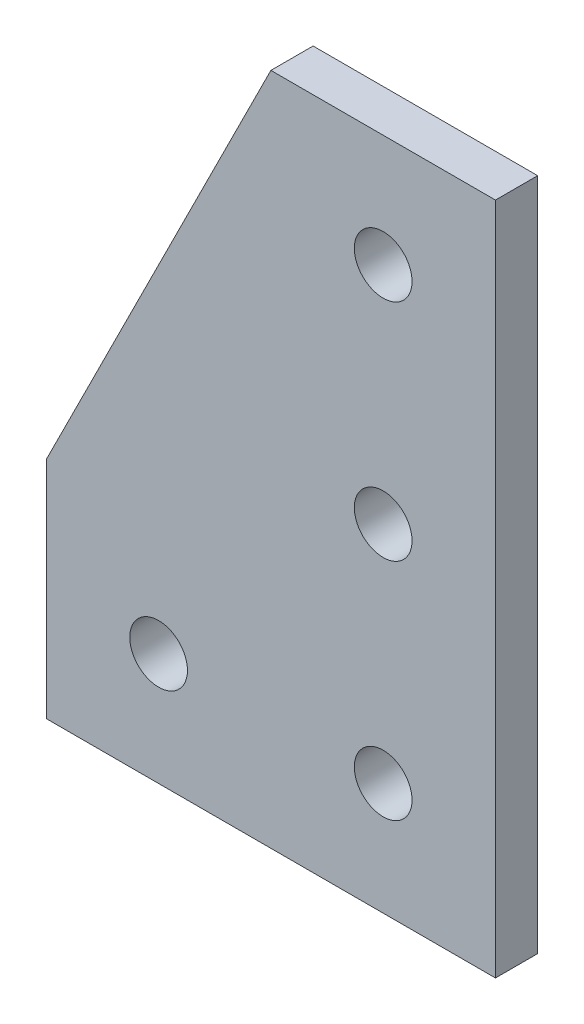
ISO-10303-21;
HEADER;
FILE_DESCRIPTION(('STEP AP214'),'2;1');
FILE_NAME('part.step','',(''),(''),'','','');
FILE_SCHEMA(('AUTOMOTIVE_DESIGN { 1 0 10303 214 1 1 1 1 }'));
ENDSEC;
DATA;
#1=APPLICATION_CONTEXT('core data for automotive mechanical design processes');
#2=APPLICATION_PROTOCOL_DEFINITION('international standard','automotive_design',2000,#1);
#3=PRODUCT_CONTEXT('',#1,'mechanical');
#4=PRODUCT('Part','Part','',(#3));
#5=PRODUCT_RELATED_PRODUCT_CATEGORY('part','',(#4));
#6=PRODUCT_DEFINITION_FORMATION('','',#4);
#7=PRODUCT_DEFINITION_CONTEXT('part definition',#1,'design');
#8=PRODUCT_DEFINITION('design','',#6,#7);
#9=PRODUCT_DEFINITION_SHAPE('','',#8);
#10=(LENGTH_UNIT() NAMED_UNIT(*) SI_UNIT(.MILLI.,.METRE.));
#11=(NAMED_UNIT(*) PLANE_ANGLE_UNIT() SI_UNIT($,.RADIAN.));
#12=(NAMED_UNIT(*) SI_UNIT($,.STERADIAN.) SOLID_ANGLE_UNIT());
#13=UNCERTAINTY_MEASURE_WITH_UNIT(LENGTH_MEASURE(1.E-05),#10,'distance_accuracy_value','');
#14=(GEOMETRIC_REPRESENTATION_CONTEXT(3) GLOBAL_UNCERTAINTY_ASSIGNED_CONTEXT((#13)) GLOBAL_UNIT_ASSIGNED_CONTEXT((#10,
#11,#12)) REPRESENTATION_CONTEXT('',''));
#15=CARTESIAN_POINT('',(0.,0.,0.));
#16=DIRECTION('',(0.,0.,1.));
#17=DIRECTION('',(1.,0.,0.));
#18=AXIS2_PLACEMENT_3D('',#15,#16,#17);
#19=CARTESIAN_POINT('',(0.,0.,0.));
#20=DIRECTION('',(0.,0.,1.));
#21=DIRECTION('',(1.,0.,0.));
#22=AXIS2_PLACEMENT_3D('',#19,#20,#21);
#23=PLANE('',#22);
#24=DIRECTION('',(-0.447213595499958,-0.894427190999916,0.));
#25=VECTOR('',#24,1.);
#26=CARTESIAN_POINT('',(0.,76.2,0.));
#27=LINE('',#26,#25);
#28=CARTESIAN_POINT('',(0.,76.2,0.));
#29=VERTEX_POINT('',#28);
#30=CARTESIAN_POINT('',(-25.4,25.4,0.));
#31=VERTEX_POINT('',#30);
#32=EDGE_CURVE('E187',#29,#31,#27,.T.);
#33=ORIENTED_EDGE('',*,*,#32,.F.);
#34=DIRECTION('',(-1.,0.,0.));
#35=VECTOR('',#34,1.);
#36=CARTESIAN_POINT('',(25.4,76.2,0.));
#37=LINE('',#36,#35);
#38=CARTESIAN_POINT('',(25.4,76.2,0.));
#39=VERTEX_POINT('',#38);
#40=EDGE_CURVE('E26',#39,#29,#37,.T.);
#41=ORIENTED_EDGE('',*,*,#40,.F.);
#42=DIRECTION('',(0.,1.,0.));
#43=VECTOR('',#42,1.);
#44=CARTESIAN_POINT('',(25.4,0.,0.));
#45=LINE('',#44,#43);
#46=CARTESIAN_POINT('',(25.4,0.,0.));
#47=VERTEX_POINT('',#46);
#48=EDGE_CURVE('E121',#47,#39,#45,.T.);
#49=ORIENTED_EDGE('',*,*,#48,.F.);
#50=DIRECTION('',(1.,0.,0.));
#51=VECTOR('',#50,1.);
#52=CARTESIAN_POINT('',(-25.4,0.,0.));
#53=LINE('',#52,#51);
#54=CARTESIAN_POINT('',(-25.4,0.,0.));
#55=VERTEX_POINT('',#54);
#56=EDGE_CURVE('E134',#55,#47,#53,.T.);
#57=ORIENTED_EDGE('',*,*,#56,.F.);
#58=DIRECTION('',(0.,-1.,0.));
#59=VECTOR('',#58,1.);
#60=CARTESIAN_POINT('',(-25.4,25.4,0.));
#61=LINE('',#60,#59);
#62=EDGE_CURVE('E137',#31,#55,#61,.T.);
#63=ORIENTED_EDGE('',*,*,#62,.F.);
#64=EDGE_LOOP('',(#33,#41,#49,#57,#63));
#65=FACE_BOUND('',#64,.T.);
#66=CARTESIAN_POINT('',(12.7,12.7,0.));
#67=DIRECTION('',(0.,0.,1.));
#68=DIRECTION('',(1.,0.,0.));
#69=AXIS2_PLACEMENT_3D('',#66,#67,#68);
#70=CIRCLE('',#69,3.2639);
#71=CARTESIAN_POINT('',(15.9639,12.7,0.));
#72=VERTEX_POINT('',#71);
#73=EDGE_CURVE('E159',#72,#72,#70,.T.);
#74=ORIENTED_EDGE('',*,*,#73,.T.);
#75=EDGE_LOOP('',(#74));
#76=FACE_BOUND('',#75,.T.);
#77=CARTESIAN_POINT('',(12.7,38.1,0.));
#78=DIRECTION('',(0.,0.,1.));
#79=DIRECTION('',(1.,0.,0.));
#80=AXIS2_PLACEMENT_3D('',#77,#78,#79);
#81=CIRCLE('',#80,3.2639);
#82=CARTESIAN_POINT('',(15.9639,38.1,0.));
#83=VERTEX_POINT('',#82);
#84=EDGE_CURVE('E158',#83,#83,#81,.T.);
#85=ORIENTED_EDGE('',*,*,#84,.T.);
#86=EDGE_LOOP('',(#85));
#87=FACE_BOUND('',#86,.T.);
#88=CARTESIAN_POINT('',(12.7,63.5,0.));
#89=DIRECTION('',(0.,0.,1.));
#90=DIRECTION('',(1.,0.,0.));
#91=AXIS2_PLACEMENT_3D('',#88,#89,#90);
#92=CIRCLE('',#91,3.2639);
#93=CARTESIAN_POINT('',(15.9639,63.5,0.));
#94=VERTEX_POINT('',#93);
#95=EDGE_CURVE('E172',#94,#94,#92,.T.);
#96=ORIENTED_EDGE('',*,*,#95,.T.);
#97=EDGE_LOOP('',(#96));
#98=FACE_BOUND('',#97,.T.);
#99=CARTESIAN_POINT('',(-12.7,12.7,0.));
#100=DIRECTION('',(0.,0.,1.));
#101=DIRECTION('',(1.,0.,0.));
#102=AXIS2_PLACEMENT_3D('',#99,#100,#101);
#103=CIRCLE('',#102,3.2639);
#104=CARTESIAN_POINT('',(-9.4361,12.7,0.));
#105=VERTEX_POINT('',#104);
#106=EDGE_CURVE('E38',#105,#105,#103,.T.);
#107=ORIENTED_EDGE('',*,*,#106,.T.);
#108=EDGE_LOOP('',(#107));
#109=FACE_BOUND('',#108,.T.);
#110=ADVANCED_FACE('F16',(#65,#76,#87,#98,#109),#23,.F.);
#111=CARTESIAN_POINT('',(0.,0.,4.7752));
#112=DIRECTION('',(0.,0.,1.));
#113=DIRECTION('',(1.,0.,0.));
#114=AXIS2_PLACEMENT_3D('',#111,#112,#113);
#115=PLANE('',#114);
#116=DIRECTION('',(-0.447213595499958,-0.894427190999916,0.));
#117=VECTOR('',#116,1.);
#118=CARTESIAN_POINT('',(0.,76.2,4.7752));
#119=LINE('',#118,#117);
#120=CARTESIAN_POINT('',(0.,76.2,4.7752));
#121=VERTEX_POINT('',#120);
#122=CARTESIAN_POINT('',(-25.4,25.4,4.7752));
#123=VERTEX_POINT('',#122);
#124=EDGE_CURVE('E129',#121,#123,#119,.T.);
#125=ORIENTED_EDGE('',*,*,#124,.T.);
#126=DIRECTION('',(0.,-1.,0.));
#127=VECTOR('',#126,1.);
#128=CARTESIAN_POINT('',(-25.4,25.4,4.7752));
#129=LINE('',#128,#127);
#130=CARTESIAN_POINT('',(-25.4,0.,4.7752));
#131=VERTEX_POINT('',#130);
#132=EDGE_CURVE('E125',#123,#131,#129,.T.);
#133=ORIENTED_EDGE('',*,*,#132,.T.);
#134=DIRECTION('',(1.,0.,0.));
#135=VECTOR('',#134,1.);
#136=CARTESIAN_POINT('',(-25.4,0.,4.7752));
#137=LINE('',#136,#135);
#138=CARTESIAN_POINT('',(25.4,0.,4.7752));
#139=VERTEX_POINT('',#138);
#140=EDGE_CURVE('E110',#131,#139,#137,.T.);
#141=ORIENTED_EDGE('',*,*,#140,.T.);
#142=DIRECTION('',(0.,1.,0.));
#143=VECTOR('',#142,1.);
#144=CARTESIAN_POINT('',(25.4,0.,4.7752));
#145=LINE('',#144,#143);
#146=CARTESIAN_POINT('',(25.4,76.2,4.7752));
#147=VERTEX_POINT('',#146);
#148=EDGE_CURVE('E162',#139,#147,#145,.T.);
#149=ORIENTED_EDGE('',*,*,#148,.T.);
#150=DIRECTION('',(-1.,0.,0.));
#151=VECTOR('',#150,1.);
#152=CARTESIAN_POINT('',(25.4,76.2,4.7752));
#153=LINE('',#152,#151);
#154=EDGE_CURVE('E11',#147,#121,#153,.T.);
#155=ORIENTED_EDGE('',*,*,#154,.T.);
#156=EDGE_LOOP('',(#125,#133,#141,#149,#155));
#157=FACE_BOUND('',#156,.T.);
#158=CARTESIAN_POINT('',(12.7,12.7,4.7752));
#159=DIRECTION('',(0.,0.,1.));
#160=DIRECTION('',(1.,0.,0.));
#161=AXIS2_PLACEMENT_3D('',#158,#159,#160);
#162=CIRCLE('',#161,3.2639);
#163=CARTESIAN_POINT('',(15.9639,12.7,4.7752));
#164=VERTEX_POINT('',#163);
#165=EDGE_CURVE('E70',#164,#164,#162,.T.);
#166=ORIENTED_EDGE('',*,*,#165,.F.);
#167=EDGE_LOOP('',(#166));
#168=FACE_BOUND('',#167,.T.);
#169=CARTESIAN_POINT('',(12.7,38.1,4.7752));
#170=DIRECTION('',(0.,0.,1.));
#171=DIRECTION('',(1.,0.,0.));
#172=AXIS2_PLACEMENT_3D('',#169,#170,#171);
#173=CIRCLE('',#172,3.2639);
#174=CARTESIAN_POINT('',(15.9639,38.1,4.7752));
#175=VERTEX_POINT('',#174);
#176=EDGE_CURVE('E154',#175,#175,#173,.T.);
#177=ORIENTED_EDGE('',*,*,#176,.F.);
#178=EDGE_LOOP('',(#177));
#179=FACE_BOUND('',#178,.T.);
#180=CARTESIAN_POINT('',(12.7,63.5,4.7752));
#181=DIRECTION('',(0.,0.,1.));
#182=DIRECTION('',(1.,0.,0.));
#183=AXIS2_PLACEMENT_3D('',#180,#181,#182);
#184=CIRCLE('',#183,3.2639);
#185=CARTESIAN_POINT('',(15.9639,63.5,4.7752));
#186=VERTEX_POINT('',#185);
#187=EDGE_CURVE('E19',#186,#186,#184,.T.);
#188=ORIENTED_EDGE('',*,*,#187,.F.);
#189=EDGE_LOOP('',(#188));
#190=FACE_BOUND('',#189,.T.);
#191=CARTESIAN_POINT('',(-12.7,12.7,4.7752));
#192=DIRECTION('',(0.,0.,1.));
#193=DIRECTION('',(1.,0.,0.));
#194=AXIS2_PLACEMENT_3D('',#191,#192,#193);
#195=CIRCLE('',#194,3.2639);
#196=CARTESIAN_POINT('',(-9.4361,12.7,4.7752));
#197=VERTEX_POINT('',#196);
#198=EDGE_CURVE('E174',#197,#197,#195,.T.);
#199=ORIENTED_EDGE('',*,*,#198,.F.);
#200=EDGE_LOOP('',(#199));
#201=FACE_BOUND('',#200,.T.);
#202=ADVANCED_FACE('F126',(#157,#168,#179,#190,#201),#115,.T.);
#203=CARTESIAN_POINT('',(25.4,76.2,4.7752));
#204=DIRECTION('',(0.,-1.,0.));
#205=DIRECTION('',(0.,0.,-1.));
#206=AXIS2_PLACEMENT_3D('',#203,#204,#205);
#207=PLANE('',#206);
#208=ORIENTED_EDGE('',*,*,#40,.T.);
#209=DIRECTION('',(0.,0.,-1.));
#210=VECTOR('',#209,1.);
#211=CARTESIAN_POINT('',(0.,76.2,4.7752));
#212=LINE('',#211,#210);
#213=EDGE_CURVE('E144',#121,#29,#212,.T.);
#214=ORIENTED_EDGE('',*,*,#213,.F.);
#215=ORIENTED_EDGE('',*,*,#154,.F.);
#216=DIRECTION('',(0.,0.,-1.));
#217=VECTOR('',#216,1.);
#218=CARTESIAN_POINT('',(25.4,76.2,4.7752));
#219=LINE('',#218,#217);
#220=EDGE_CURVE('E153',#147,#39,#219,.T.);
#221=ORIENTED_EDGE('',*,*,#220,.T.);
#222=EDGE_LOOP('',(#208,#214,#215,#221));
#223=FACE_BOUND('',#222,.T.);
#224=ADVANCED_FACE('F235',(#223),#207,.F.);
#225=CARTESIAN_POINT('',(-12.7,12.7,4.7752));
#226=DIRECTION('',(0.,0.,-1.));
#227=DIRECTION('',(-1.,0.,0.));
#228=AXIS2_PLACEMENT_3D('',#225,#226,#227);
#229=CYLINDRICAL_SURFACE('',#228,3.2639);
#230=ORIENTED_EDGE('',*,*,#106,.F.);
#231=EDGE_LOOP('',(#230));
#232=FACE_BOUND('',#231,.T.);
#233=ORIENTED_EDGE('',*,*,#198,.T.);
#234=EDGE_LOOP('',(#233));
#235=FACE_BOUND('',#234,.T.);
#236=ADVANCED_FACE('F240',(#232,#235),#229,.F.);
#237=CARTESIAN_POINT('',(12.7,63.5,4.7752));
#238=DIRECTION('',(0.,0.,-1.));
#239=DIRECTION('',(-1.,0.,0.));
#240=AXIS2_PLACEMENT_3D('',#237,#238,#239);
#241=CYLINDRICAL_SURFACE('',#240,3.2639);
#242=ORIENTED_EDGE('',*,*,#95,.F.);
#243=EDGE_LOOP('',(#242));
#244=FACE_BOUND('',#243,.T.);
#245=ORIENTED_EDGE('',*,*,#187,.T.);
#246=EDGE_LOOP('',(#245));
#247=FACE_BOUND('',#246,.T.);
#248=ADVANCED_FACE('F227',(#244,#247),#241,.F.);
#249=CARTESIAN_POINT('',(12.7,38.1,4.7752));
#250=DIRECTION('',(0.,0.,-1.));
#251=DIRECTION('',(-1.,0.,0.));
#252=AXIS2_PLACEMENT_3D('',#249,#250,#251);
#253=CYLINDRICAL_SURFACE('',#252,3.2639);
#254=ORIENTED_EDGE('',*,*,#84,.F.);
#255=EDGE_LOOP('',(#254));
#256=FACE_BOUND('',#255,.T.);
#257=ORIENTED_EDGE('',*,*,#176,.T.);
#258=EDGE_LOOP('',(#257));
#259=FACE_BOUND('',#258,.T.);
#260=ADVANCED_FACE('F219',(#256,#259),#253,.F.);
#261=CARTESIAN_POINT('',(12.7,12.7,4.7752));
#262=DIRECTION('',(0.,0.,-1.));
#263=DIRECTION('',(-1.,0.,0.));
#264=AXIS2_PLACEMENT_3D('',#261,#262,#263);
#265=CYLINDRICAL_SURFACE('',#264,3.2639);
#266=ORIENTED_EDGE('',*,*,#73,.F.);
#267=EDGE_LOOP('',(#266));
#268=FACE_BOUND('',#267,.T.);
#269=ORIENTED_EDGE('',*,*,#165,.T.);
#270=EDGE_LOOP('',(#269));
#271=FACE_BOUND('',#270,.T.);
#272=ADVANCED_FACE('F217',(#268,#271),#265,.F.);
#273=CARTESIAN_POINT('',(25.4,0.,4.7752));
#274=DIRECTION('',(-1.,0.,0.));
#275=DIRECTION('',(0.,0.,1.));
#276=AXIS2_PLACEMENT_3D('',#273,#274,#275);
#277=PLANE('',#276);
#278=ORIENTED_EDGE('',*,*,#48,.T.);
#279=ORIENTED_EDGE('',*,*,#220,.F.);
#280=ORIENTED_EDGE('',*,*,#148,.F.);
#281=DIRECTION('',(0.,0.,-1.));
#282=VECTOR('',#281,1.);
#283=CARTESIAN_POINT('',(25.4,0.,4.7752));
#284=LINE('',#283,#282);
#285=EDGE_CURVE('E118',#139,#47,#284,.T.);
#286=ORIENTED_EDGE('',*,*,#285,.T.);
#287=EDGE_LOOP('',(#278,#279,#280,#286));
#288=FACE_BOUND('',#287,.T.);
#289=ADVANCED_FACE('F206',(#288),#277,.F.);
#290=CARTESIAN_POINT('',(-25.4,0.,4.7752));
#291=DIRECTION('',(0.,1.,0.));
#292=DIRECTION('',(1.,0.,0.));
#293=AXIS2_PLACEMENT_3D('',#290,#291,#292);
#294=PLANE('',#293);
#295=ORIENTED_EDGE('',*,*,#56,.T.);
#296=ORIENTED_EDGE('',*,*,#285,.F.);
#297=ORIENTED_EDGE('',*,*,#140,.F.);
#298=DIRECTION('',(0.,0.,-1.));
#299=VECTOR('',#298,1.);
#300=CARTESIAN_POINT('',(-25.4,0.,4.7752));
#301=LINE('',#300,#299);
#302=EDGE_CURVE('E115',#131,#55,#301,.T.);
#303=ORIENTED_EDGE('',*,*,#302,.T.);
#304=EDGE_LOOP('',(#295,#296,#297,#303));
#305=FACE_BOUND('',#304,.T.);
#306=ADVANCED_FACE('F113',(#305),#294,.F.);
#307=CARTESIAN_POINT('',(-25.4,25.4,4.7752));
#308=DIRECTION('',(1.,0.,0.));
#309=DIRECTION('',(0.,1.,0.));
#310=AXIS2_PLACEMENT_3D('',#307,#308,#309);
#311=PLANE('',#310);
#312=ORIENTED_EDGE('',*,*,#62,.T.);
#313=ORIENTED_EDGE('',*,*,#302,.F.);
#314=ORIENTED_EDGE('',*,*,#132,.F.);
#315=DIRECTION('',(0.,0.,-1.));
#316=VECTOR('',#315,1.);
#317=CARTESIAN_POINT('',(-25.4,25.4,4.7752));
#318=LINE('',#317,#316);
#319=EDGE_CURVE('E189',#123,#31,#318,.T.);
#320=ORIENTED_EDGE('',*,*,#319,.T.);
#321=EDGE_LOOP('',(#312,#313,#314,#320));
#322=FACE_BOUND('',#321,.T.);
#323=ADVANCED_FACE('F136',(#322),#311,.F.);
#324=CARTESIAN_POINT('',(0.,76.2,4.7752));
#325=DIRECTION('',(0.894427190999916,-0.447213595499958,0.));
#326=DIRECTION('',(0.,0.,-1.));
#327=AXIS2_PLACEMENT_3D('',#324,#325,#326);
#328=PLANE('',#327);
#329=ORIENTED_EDGE('',*,*,#32,.T.);
#330=ORIENTED_EDGE('',*,*,#319,.F.);
#331=ORIENTED_EDGE('',*,*,#124,.F.);
#332=ORIENTED_EDGE('',*,*,#213,.T.);
#333=EDGE_LOOP('',(#329,#330,#331,#332));
#334=FACE_BOUND('',#333,.T.);
#335=ADVANCED_FACE('F201',(#334),#328,.F.);
#336=CLOSED_SHELL('',(#110,#202,#224,#236,#248,#260,#272,#289,#306,#323,#335));
#337=MANIFOLD_SOLID_BREP('B1',#336);
#338=ADVANCED_BREP_SHAPE_REPRESENTATION('',(#18,#337),#14);
#339=SHAPE_DEFINITION_REPRESENTATION(#9,#338);
ENDSEC;
END-ISO-10303-21;
